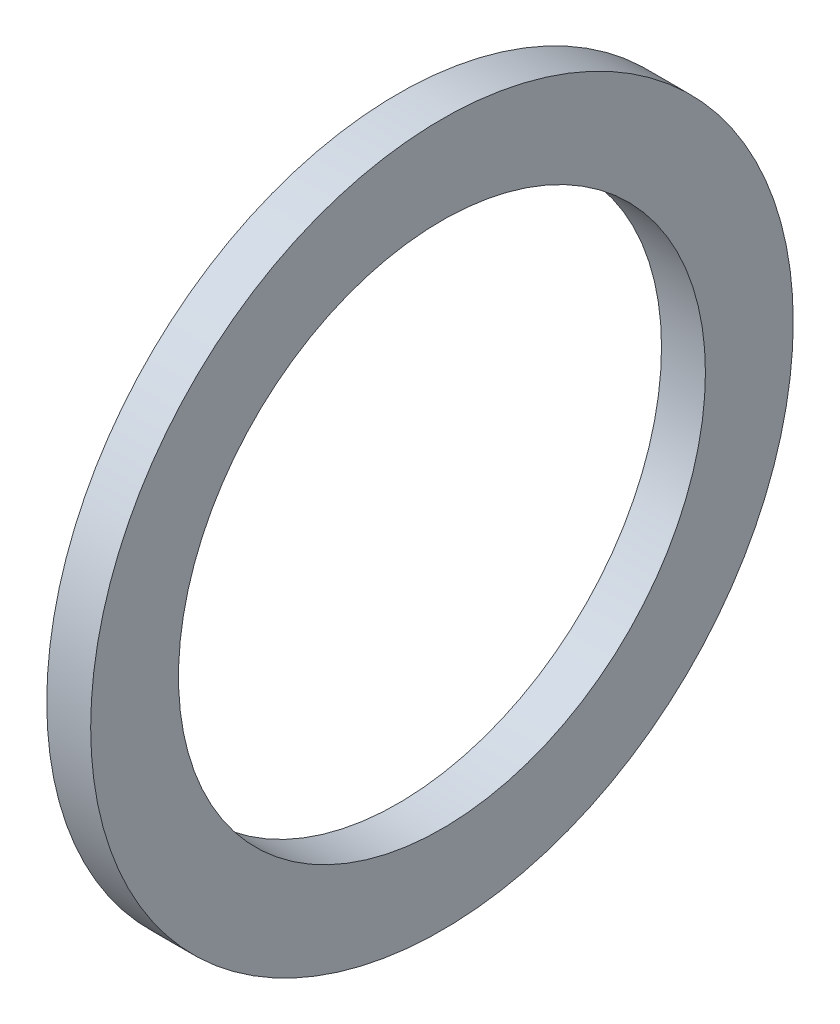
ISO-10303-21;
HEADER;
FILE_DESCRIPTION(('STEP AP214'),'2;1');
FILE_NAME('part.step','',(''),(''),'','','');
FILE_SCHEMA(('AUTOMOTIVE_DESIGN { 1 0 10303 214 1 1 1 1 }'));
ENDSEC;
DATA;
#1=APPLICATION_CONTEXT('core data for automotive mechanical design processes');
#2=APPLICATION_PROTOCOL_DEFINITION('international standard','automotive_design',2000,#1);
#3=PRODUCT_CONTEXT('',#1,'mechanical');
#4=PRODUCT('Part','Part','',(#3));
#5=PRODUCT_RELATED_PRODUCT_CATEGORY('part','',(#4));
#6=PRODUCT_DEFINITION_FORMATION('','',#4);
#7=PRODUCT_DEFINITION_CONTEXT('part definition',#1,'design');
#8=PRODUCT_DEFINITION('design','',#6,#7);
#9=PRODUCT_DEFINITION_SHAPE('','',#8);
#10=(LENGTH_UNIT() NAMED_UNIT(*) SI_UNIT(.MILLI.,.METRE.));
#11=(NAMED_UNIT(*) PLANE_ANGLE_UNIT() SI_UNIT($,.RADIAN.));
#12=(NAMED_UNIT(*) SI_UNIT($,.STERADIAN.) SOLID_ANGLE_UNIT());
#13=UNCERTAINTY_MEASURE_WITH_UNIT(LENGTH_MEASURE(1.E-05),#10,'distance_accuracy_value','');
#14=(GEOMETRIC_REPRESENTATION_CONTEXT(3) GLOBAL_UNCERTAINTY_ASSIGNED_CONTEXT((#13)) GLOBAL_UNIT_ASSIGNED_CONTEXT((#10,
#11,#12)) REPRESENTATION_CONTEXT('',''));
#15=CARTESIAN_POINT('',(0.,0.,0.));
#16=DIRECTION('',(0.,0.,1.));
#17=DIRECTION('',(1.,0.,0.));
#18=AXIS2_PLACEMENT_3D('',#15,#16,#17);
#19=CARTESIAN_POINT('',(1.5875,0.,0.));
#20=DIRECTION('',(1.,0.,0.));
#21=DIRECTION('',(0.,0.,-1.));
#22=AXIS2_PLACEMENT_3D('',#19,#20,#21);
#23=PLANE('',#22);
#24=CARTESIAN_POINT('',(1.5875,0.,0.));
#25=DIRECTION('',(1.,0.,0.));
#26=DIRECTION('',(0.,0.,-1.));
#27=AXIS2_PLACEMENT_3D('',#24,#25,#26);
#28=CIRCLE('',#27,12.7);
#29=CARTESIAN_POINT('',(1.5875,0.,-12.7));
#30=VERTEX_POINT('',#29);
#31=EDGE_CURVE('E10',#30,#30,#28,.T.);
#32=ORIENTED_EDGE('',*,*,#31,.T.);
#33=EDGE_LOOP('',(#32));
#34=FACE_BOUND('',#33,.T.);
#35=CARTESIAN_POINT('',(1.5875,0.,0.));
#36=DIRECTION('',(1.,0.,0.));
#37=DIRECTION('',(0.,0.,-1.));
#38=AXIS2_PLACEMENT_3D('',#35,#36,#37);
#39=CIRCLE('',#38,9.525);
#40=CARTESIAN_POINT('',(1.5875,0.,-9.525));
#41=VERTEX_POINT('',#40);
#42=EDGE_CURVE('E43',#41,#41,#39,.T.);
#43=ORIENTED_EDGE('',*,*,#42,.F.);
#44=EDGE_LOOP('',(#43));
#45=FACE_BOUND('',#44,.T.);
#46=ADVANCED_FACE('F32',(#34,#45),#23,.T.);
#47=CARTESIAN_POINT('',(0.,0.,0.));
#48=DIRECTION('',(1.,0.,0.));
#49=DIRECTION('',(0.,0.,-1.));
#50=AXIS2_PLACEMENT_3D('',#47,#48,#49);
#51=PLANE('',#50);
#52=CARTESIAN_POINT('',(0.,0.,0.));
#53=DIRECTION('',(1.,0.,0.));
#54=DIRECTION('',(0.,0.,-1.));
#55=AXIS2_PLACEMENT_3D('',#52,#53,#54);
#56=CIRCLE('',#55,12.7);
#57=CARTESIAN_POINT('',(0.,0.,-12.7));
#58=VERTEX_POINT('',#57);
#59=EDGE_CURVE('E36',#58,#58,#56,.T.);
#60=ORIENTED_EDGE('',*,*,#59,.F.);
#61=EDGE_LOOP('',(#60));
#62=FACE_BOUND('',#61,.T.);
#63=CARTESIAN_POINT('',(0.,0.,0.));
#64=DIRECTION('',(1.,0.,0.));
#65=DIRECTION('',(0.,0.,-1.));
#66=AXIS2_PLACEMENT_3D('',#63,#64,#65);
#67=CIRCLE('',#66,9.525);
#68=CARTESIAN_POINT('',(0.,0.,-9.525));
#69=VERTEX_POINT('',#68);
#70=EDGE_CURVE('E45',#69,#69,#67,.T.);
#71=ORIENTED_EDGE('',*,*,#70,.T.);
#72=EDGE_LOOP('',(#71));
#73=FACE_BOUND('',#72,.T.);
#74=ADVANCED_FACE('F55',(#62,#73),#51,.F.);
#75=CARTESIAN_POINT('',(1.5875,0.,0.));
#76=DIRECTION('',(-1.,0.,0.));
#77=DIRECTION('',(0.,0.,1.));
#78=AXIS2_PLACEMENT_3D('',#75,#76,#77);
#79=CYLINDRICAL_SURFACE('',#78,12.7);
#80=ORIENTED_EDGE('',*,*,#31,.F.);
#81=EDGE_LOOP('',(#80));
#82=FACE_BOUND('',#81,.T.);
#83=ORIENTED_EDGE('',*,*,#59,.T.);
#84=EDGE_LOOP('',(#83));
#85=FACE_BOUND('',#84,.T.);
#86=ADVANCED_FACE('F34',(#82,#85),#79,.T.);
#87=CARTESIAN_POINT('',(1.5875,0.,0.));
#88=DIRECTION('',(-1.,0.,0.));
#89=DIRECTION('',(0.,0.,1.));
#90=AXIS2_PLACEMENT_3D('',#87,#88,#89);
#91=CYLINDRICAL_SURFACE('',#90,9.525);
#92=ORIENTED_EDGE('',*,*,#42,.T.);
#93=EDGE_LOOP('',(#92));
#94=FACE_BOUND('',#93,.T.);
#95=ORIENTED_EDGE('',*,*,#70,.F.);
#96=EDGE_LOOP('',(#95));
#97=FACE_BOUND('',#96,.T.);
#98=ADVANCED_FACE('F51',(#94,#97),#91,.F.);
#99=CLOSED_SHELL('',(#46,#74,#86,#98));
#100=MANIFOLD_SOLID_BREP('B2',#99);
#101=ADVANCED_BREP_SHAPE_REPRESENTATION('',(#18,#100),#14);
#102=SHAPE_DEFINITION_REPRESENTATION(#9,#101);
ENDSEC;
END-ISO-10303-21;
